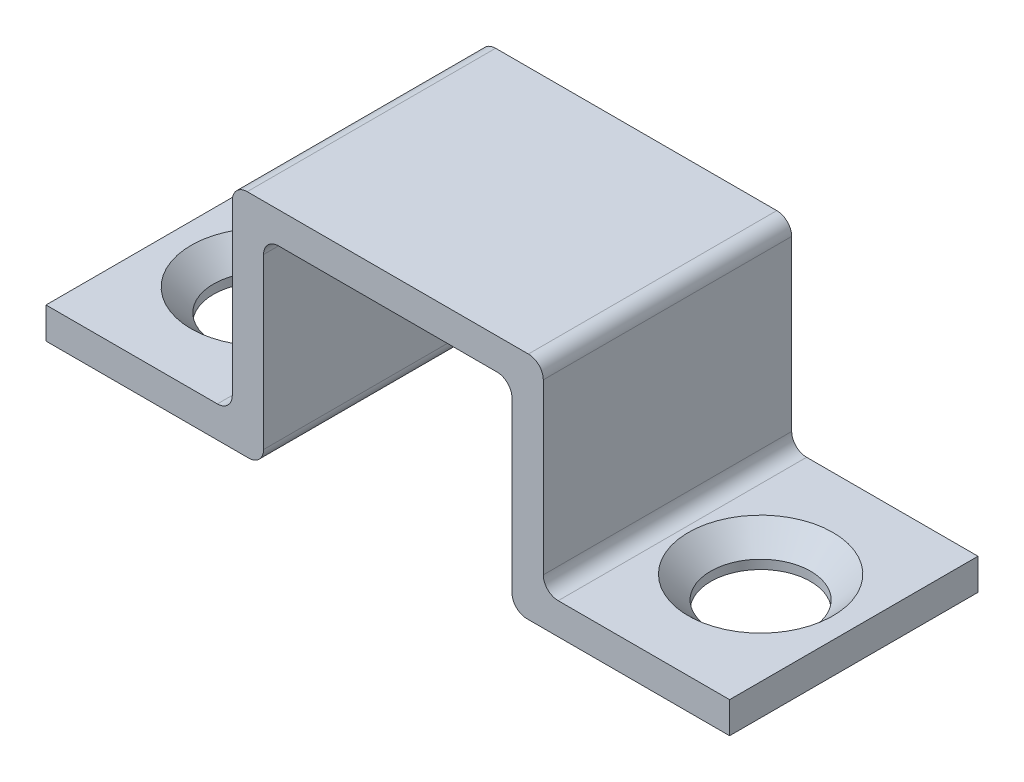
ISO-10303-21;
HEADER;
FILE_DESCRIPTION(('STEP AP214'),'2;1');
FILE_NAME('part.step','',(''),(''),'','','');
FILE_SCHEMA(('AUTOMOTIVE_DESIGN { 1 0 10303 214 1 1 1 1 }'));
ENDSEC;
DATA;
#1=APPLICATION_CONTEXT('core data for automotive mechanical design processes');
#2=APPLICATION_PROTOCOL_DEFINITION('international standard','automotive_design',2000,#1);
#3=PRODUCT_CONTEXT('',#1,'mechanical');
#4=PRODUCT('Part','Part','',(#3));
#5=PRODUCT_RELATED_PRODUCT_CATEGORY('part','',(#4));
#6=PRODUCT_DEFINITION_FORMATION('','',#4);
#7=PRODUCT_DEFINITION_CONTEXT('part definition',#1,'design');
#8=PRODUCT_DEFINITION('design','',#6,#7);
#9=PRODUCT_DEFINITION_SHAPE('','',#8);
#10=(LENGTH_UNIT() NAMED_UNIT(*) SI_UNIT(.MILLI.,.METRE.));
#11=(NAMED_UNIT(*) PLANE_ANGLE_UNIT() SI_UNIT($,.RADIAN.));
#12=(NAMED_UNIT(*) SI_UNIT($,.STERADIAN.) SOLID_ANGLE_UNIT());
#13=UNCERTAINTY_MEASURE_WITH_UNIT(LENGTH_MEASURE(1.E-05),#10,'distance_accuracy_value','');
#14=(GEOMETRIC_REPRESENTATION_CONTEXT(3) GLOBAL_UNCERTAINTY_ASSIGNED_CONTEXT((#13)) GLOBAL_UNIT_ASSIGNED_CONTEXT((#10,
#11,#12)) REPRESENTATION_CONTEXT('',''));
#15=CARTESIAN_POINT('',(0.,0.,0.));
#16=DIRECTION('',(0.,0.,1.));
#17=DIRECTION('',(1.,0.,0.));
#18=AXIS2_PLACEMENT_3D('',#15,#16,#17);
#19=CARTESIAN_POINT('',(-7.95019999999999,-10.16,6.35000000000001));
#20=DIRECTION('',(0.,-1.,0.));
#21=DIRECTION('',(0.,0.,-1.));
#22=AXIS2_PLACEMENT_3D('',#19,#20,#21);
#23=PLANE('',#22);
#24=DIRECTION('',(1.,0.,0.));
#25=VECTOR('',#24,1.);
#26=CARTESIAN_POINT('',(-7.95019999999999,-10.16,-6.35));
#27=LINE('',#26,#25);
#28=CARTESIAN_POINT('',(-17.4752,-10.16,-6.35));
#29=VERTEX_POINT('',#28);
#30=CARTESIAN_POINT('',(-7.11199999999999,-10.16,-6.35));
#31=VERTEX_POINT('',#30);
#32=EDGE_CURVE('E661',#29,#31,#27,.T.);
#33=ORIENTED_EDGE('',*,*,#32,.T.);
#34=DIRECTION('',(0.,0.,-1.));
#35=VECTOR('',#34,1.);
#36=CARTESIAN_POINT('',(-7.11199999999999,-10.16,6.35000000000001));
#37=LINE('',#36,#35);
#38=CARTESIAN_POINT('',(-7.11199999999999,-10.16,6.35000000000001));
#39=VERTEX_POINT('',#38);
#40=EDGE_CURVE('E482',#31,#39,#37,.F.);
#41=ORIENTED_EDGE('',*,*,#40,.T.);
#42=DIRECTION('',(1.,0.,0.));
#43=VECTOR('',#42,1.);
#44=CARTESIAN_POINT('',(-7.95019999999999,-10.16,6.35000000000001));
#45=LINE('',#44,#43);
#46=CARTESIAN_POINT('',(-17.4752,-10.16,6.35000000000001));
#47=VERTEX_POINT('',#46);
#48=EDGE_CURVE('E224',#47,#39,#45,.T.);
#49=ORIENTED_EDGE('',*,*,#48,.F.);
#50=DIRECTION('',(0.,0.,-1.));
#51=VECTOR('',#50,1.);
#52=CARTESIAN_POINT('',(-17.4752,-10.16,6.35000000000001));
#53=LINE('',#52,#51);
#54=EDGE_CURVE('E193',#47,#29,#53,.T.);
#55=ORIENTED_EDGE('',*,*,#54,.T.);
#56=EDGE_LOOP('',(#33,#41,#49,#55));
#57=FACE_BOUND('',#56,.T.);
#58=CARTESIAN_POINT('',(-12.7127,-10.16,0.));
#59=DIRECTION('',(0.,-1.,0.));
#60=DIRECTION('',(0.,0.,-1.));
#61=AXIS2_PLACEMENT_3D('',#58,#59,#60);
#62=CIRCLE('',#61,2.5527);
#63=CARTESIAN_POINT('',(-12.7127,-10.16,-2.5527));
#64=VERTEX_POINT('',#63);
#65=EDGE_CURVE('E194',#64,#64,#62,.F.);
#66=ORIENTED_EDGE('',*,*,#65,.T.);
#67=EDGE_LOOP('',(#66));
#68=FACE_BOUND('',#67,.T.);
#69=ADVANCED_FACE('F33',(#57,#68),#23,.T.);
#70=CARTESIAN_POINT('',(-17.4752,-8.5598,6.35000000000001));
#71=DIRECTION('',(0.,1.,0.));
#72=DIRECTION('',(0.,0.,1.));
#73=AXIS2_PLACEMENT_3D('',#70,#71,#72);
#74=PLANE('',#73);
#75=CARTESIAN_POINT('',(-12.7127,-8.5598,0.));
#76=DIRECTION('',(0.,1.,0.));
#77=DIRECTION('',(0.,0.,1.));
#78=AXIS2_PLACEMENT_3D('',#75,#76,#77);
#79=CIRCLE('',#78,3.69570000000001);
#80=CARTESIAN_POINT('',(-12.7127,-8.5598,3.69570000000002));
#81=VERTEX_POINT('',#80);
#82=EDGE_CURVE('E375',#81,#81,#79,.F.);
#83=ORIENTED_EDGE('',*,*,#82,.T.);
#84=EDGE_LOOP('',(#83));
#85=FACE_BOUND('',#84,.T.);
#86=DIRECTION('',(1.,0.,0.));
#87=VECTOR('',#86,1.);
#88=CARTESIAN_POINT('',(-17.4752,-8.5598,6.35000000000001));
#89=LINE('',#88,#87);
#90=CARTESIAN_POINT('',(-17.4752,-8.5598,6.35000000000001));
#91=VERTEX_POINT('',#90);
#92=CARTESIAN_POINT('',(-8.7122,-8.5598,6.35000000000001));
#93=VERTEX_POINT('',#92);
#94=EDGE_CURVE('E172',#91,#93,#89,.T.);
#95=ORIENTED_EDGE('',*,*,#94,.T.);
#96=DIRECTION('',(0.,0.,1.));
#97=VECTOR('',#96,1.);
#98=CARTESIAN_POINT('',(-8.71219999999999,-8.5598,-6.35));
#99=LINE('',#98,#97);
#100=CARTESIAN_POINT('',(-8.7122,-8.5598,-6.35));
#101=VERTEX_POINT('',#100);
#102=EDGE_CURVE('E354',#93,#101,#99,.F.);
#103=ORIENTED_EDGE('',*,*,#102,.T.);
#104=DIRECTION('',(1.,0.,0.));
#105=VECTOR('',#104,1.);
#106=CARTESIAN_POINT('',(-17.4752,-8.5598,-6.35));
#107=LINE('',#106,#105);
#108=CARTESIAN_POINT('',(-17.4752,-8.5598,-6.35));
#109=VERTEX_POINT('',#108);
#110=EDGE_CURVE('E184',#109,#101,#107,.T.);
#111=ORIENTED_EDGE('',*,*,#110,.F.);
#112=DIRECTION('',(0.,0.,1.));
#113=VECTOR('',#112,1.);
#114=CARTESIAN_POINT('',(-17.4752,-8.5598,6.35000000000001));
#115=LINE('',#114,#113);
#116=EDGE_CURVE('E190',#109,#91,#115,.T.);
#117=ORIENTED_EDGE('',*,*,#116,.T.);
#118=EDGE_LOOP('',(#95,#103,#111,#117));
#119=FACE_BOUND('',#118,.T.);
#120=ADVANCED_FACE('F196',(#85,#119),#74,.T.);
#121=CARTESIAN_POINT('',(-7.95019999999999,0.,0.));
#122=DIRECTION('',(-1.,0.,0.));
#123=DIRECTION('',(0.,0.,-1.));
#124=AXIS2_PLACEMENT_3D('',#121,#122,#123);
#125=PLANE('',#124);
#126=DIRECTION('',(0.,1.,0.));
#127=VECTOR('',#126,1.);
#128=CARTESIAN_POINT('',(-7.95019999999999,1.6002,-6.34999999999999));
#129=LINE('',#128,#127);
#130=CARTESIAN_POINT('',(-7.95019999999999,-7.7978,-6.35));
#131=VERTEX_POINT('',#130);
#132=CARTESIAN_POINT('',(-7.95019999999999,0.8382,-6.34999999999999));
#133=VERTEX_POINT('',#132);
#134=EDGE_CURVE('E212',#131,#133,#129,.T.);
#135=ORIENTED_EDGE('',*,*,#134,.F.);
#136=DIRECTION('',(0.,0.,1.));
#137=VECTOR('',#136,1.);
#138=CARTESIAN_POINT('',(-7.95019999999999,-7.7978,6.35000000000001));
#139=LINE('',#138,#137);
#140=CARTESIAN_POINT('',(-7.95019999999999,-7.7978,6.35000000000001));
#141=VERTEX_POINT('',#140);
#142=EDGE_CURVE('E490',#131,#141,#139,.T.);
#143=ORIENTED_EDGE('',*,*,#142,.T.);
#144=DIRECTION('',(0.,-1.,0.));
#145=VECTOR('',#144,1.);
#146=CARTESIAN_POINT('',(-7.95019999999999,1.6002,6.35000000000001));
#147=LINE('',#146,#145);
#148=CARTESIAN_POINT('',(-7.95019999999999,0.8382,6.35000000000001));
#149=VERTEX_POINT('',#148);
#150=EDGE_CURVE('E209',#149,#141,#147,.T.);
#151=ORIENTED_EDGE('',*,*,#150,.F.);
#152=DIRECTION('',(0.,0.,1.));
#153=VECTOR('',#152,1.);
#154=CARTESIAN_POINT('',(-7.95019999999999,0.8382,-6.34999999999999));
#155=LINE('',#154,#153);
#156=EDGE_CURVE('E488',#149,#133,#155,.F.);
#157=ORIENTED_EDGE('',*,*,#156,.T.);
#158=EDGE_LOOP('',(#135,#143,#151,#157));
#159=FACE_BOUND('',#158,.T.);
#160=ADVANCED_FACE('F403',(#159),#125,.T.);
#161=CARTESIAN_POINT('',(-6.35000000000001,1.6002,-6.34999999999999));
#162=DIRECTION('',(0.,0.,1.));
#163=DIRECTION('',(1.,0.,0.));
#164=AXIS2_PLACEMENT_3D('',#161,#162,#163);
#165=PLANE('',#164);
#166=DIRECTION('',(-1.,0.,0.));
#167=VECTOR('',#166,1.);
#168=CARTESIAN_POINT('',(7.95019999999999,-10.16,-6.35));
#169=LINE('',#168,#167);
#170=CARTESIAN_POINT('',(17.4752,-10.16,-6.35));
#171=VERTEX_POINT('',#170);
#172=CARTESIAN_POINT('',(7.11199999999999,-10.16,-6.35));
#173=VERTEX_POINT('',#172);
#174=EDGE_CURVE('E239',#171,#173,#169,.T.);
#175=ORIENTED_EDGE('',*,*,#174,.T.);
#176=CARTESIAN_POINT('',(7.11199999999999,-9.398,-6.34999999999999));
#177=DIRECTION('',(0.,0.,1.));
#178=DIRECTION('',(1.,0.,0.));
#179=AXIS2_PLACEMENT_3D('',#176,#177,#178);
#180=CIRCLE('',#179,0.762);
#181=CARTESIAN_POINT('',(6.34999999999999,-9.398,-6.35));
#182=VERTEX_POINT('',#181);
#183=EDGE_CURVE('E255',#173,#182,#180,.F.);
#184=ORIENTED_EDGE('',*,*,#183,.T.);
#185=DIRECTION('',(0.,1.,0.));
#186=VECTOR('',#185,1.);
#187=CARTESIAN_POINT('',(6.34999999999999,1.6002,-6.34999999999999));
#188=LINE('',#187,#186);
#189=CARTESIAN_POINT('',(6.34999999999999,-0.761999999999999,-6.34999999999999));
#190=VERTEX_POINT('',#189);
#191=EDGE_CURVE('E240',#182,#190,#188,.T.);
#192=ORIENTED_EDGE('',*,*,#191,.T.);
#193=CARTESIAN_POINT('',(5.58799999999999,-0.762,-6.34999999999999));
#194=DIRECTION('',(0.,0.,1.));
#195=DIRECTION('',(1.,0.,0.));
#196=AXIS2_PLACEMENT_3D('',#193,#194,#195);
#197=CIRCLE('',#196,0.762);
#198=CARTESIAN_POINT('',(5.58799999999999,0.,-6.34999999999999));
#199=VERTEX_POINT('',#198);
#200=EDGE_CURVE('E361',#190,#199,#197,.T.);
#201=ORIENTED_EDGE('',*,*,#200,.T.);
#202=DIRECTION('',(-1.,0.,0.));
#203=VECTOR('',#202,1.);
#204=CARTESIAN_POINT('',(-6.35000000000001,0.,-6.34999999999999));
#205=LINE('',#204,#203);
#206=CARTESIAN_POINT('',(-5.58799999999999,0.,-6.34999999999999));
#207=VERTEX_POINT('',#206);
#208=EDGE_CURVE('E230',#199,#207,#205,.T.);
#209=ORIENTED_EDGE('',*,*,#208,.T.);
#210=CARTESIAN_POINT('',(-5.58799999999999,-0.762,-6.34999999999999));
#211=DIRECTION('',(0.,0.,1.));
#212=DIRECTION('',(1.,0.,0.));
#213=AXIS2_PLACEMENT_3D('',#210,#211,#212);
#214=CIRCLE('',#213,0.762);
#215=CARTESIAN_POINT('',(-6.34999999999999,-0.761999999999999,-6.34999999999999));
#216=VERTEX_POINT('',#215);
#217=EDGE_CURVE('E366',#207,#216,#214,.T.);
#218=ORIENTED_EDGE('',*,*,#217,.T.);
#219=DIRECTION('',(0.,1.,0.));
#220=VECTOR('',#219,1.);
#221=CARTESIAN_POINT('',(-6.34999999999999,1.6002,-6.34999999999999));
#222=LINE('',#221,#220);
#223=CARTESIAN_POINT('',(-6.34999999999999,-9.398,-6.35));
#224=VERTEX_POINT('',#223);
#225=EDGE_CURVE('E213',#224,#216,#222,.T.);
#226=ORIENTED_EDGE('',*,*,#225,.F.);
#227=CARTESIAN_POINT('',(-7.11199999999999,-9.398,-6.34999999999999));
#228=DIRECTION('',(0.,0.,1.));
#229=DIRECTION('',(1.,0.,0.));
#230=AXIS2_PLACEMENT_3D('',#227,#228,#229);
#231=CIRCLE('',#230,0.762);
#232=EDGE_CURVE('E334',#224,#31,#231,.F.);
#233=ORIENTED_EDGE('',*,*,#232,.T.);
#234=ORIENTED_EDGE('',*,*,#32,.F.);
#235=DIRECTION('',(0.,1.,0.));
#236=VECTOR('',#235,1.);
#237=CARTESIAN_POINT('',(-17.4752,-10.16,-6.35));
#238=LINE('',#237,#236);
#239=EDGE_CURVE('E198',#29,#109,#238,.T.);
#240=ORIENTED_EDGE('',*,*,#239,.T.);
#241=ORIENTED_EDGE('',*,*,#110,.T.);
#242=CARTESIAN_POINT('',(-8.71219999999999,-7.7978,-6.34999999999999));
#243=DIRECTION('',(0.,0.,1.));
#244=DIRECTION('',(1.,0.,0.));
#245=AXIS2_PLACEMENT_3D('',#242,#243,#244);
#246=CIRCLE('',#245,0.762);
#247=EDGE_CURVE('E369',#101,#131,#246,.T.);
#248=ORIENTED_EDGE('',*,*,#247,.T.);
#249=ORIENTED_EDGE('',*,*,#134,.T.);
#250=CARTESIAN_POINT('',(-7.18819999999999,0.8382,-6.34999999999999));
#251=DIRECTION('',(0.,0.,1.));
#252=DIRECTION('',(1.,0.,0.));
#253=AXIS2_PLACEMENT_3D('',#250,#251,#252);
#254=CIRCLE('',#253,0.762);
#255=CARTESIAN_POINT('',(-7.18819999999999,1.6002,-6.34999999999999));
#256=VERTEX_POINT('',#255);
#257=EDGE_CURVE('E291',#133,#256,#254,.F.);
#258=ORIENTED_EDGE('',*,*,#257,.T.);
#259=DIRECTION('',(-1.,0.,0.));
#260=VECTOR('',#259,1.);
#261=CARTESIAN_POINT('',(-6.35000000000001,1.6002,-6.34999999999999));
#262=LINE('',#261,#260);
#263=CARTESIAN_POINT('',(7.18819999999999,1.6002,-6.34999999999999));
#264=VERTEX_POINT('',#263);
#265=EDGE_CURVE('E264',#264,#256,#262,.T.);
#266=ORIENTED_EDGE('',*,*,#265,.F.);
#267=CARTESIAN_POINT('',(7.18819999999999,0.8382,-6.34999999999999));
#268=DIRECTION('',(0.,0.,1.));
#269=DIRECTION('',(1.,0.,0.));
#270=AXIS2_PLACEMENT_3D('',#267,#268,#269);
#271=CIRCLE('',#270,0.762);
#272=CARTESIAN_POINT('',(7.95019999999999,0.8382,-6.34999999999999));
#273=VERTEX_POINT('',#272);
#274=EDGE_CURVE('E285',#264,#273,#271,.F.);
#275=ORIENTED_EDGE('',*,*,#274,.T.);
#276=DIRECTION('',(0.,1.,0.));
#277=VECTOR('',#276,1.);
#278=CARTESIAN_POINT('',(7.95019999999999,1.6002,-6.34999999999999));
#279=LINE('',#278,#277);
#280=CARTESIAN_POINT('',(7.95019999999999,-7.7978,-6.35));
#281=VERTEX_POINT('',#280);
#282=EDGE_CURVE('E235',#281,#273,#279,.T.);
#283=ORIENTED_EDGE('',*,*,#282,.F.);
#284=CARTESIAN_POINT('',(8.71219999999999,-7.7978,-6.34999999999999));
#285=DIRECTION('',(0.,0.,1.));
#286=DIRECTION('',(1.,0.,0.));
#287=AXIS2_PLACEMENT_3D('',#284,#285,#286);
#288=CIRCLE('',#287,0.762);
#289=CARTESIAN_POINT('',(8.7122,-8.5598,-6.35));
#290=VERTEX_POINT('',#289);
#291=EDGE_CURVE('E373',#281,#290,#288,.T.);
#292=ORIENTED_EDGE('',*,*,#291,.T.);
#293=DIRECTION('',(-1.,0.,0.));
#294=VECTOR('',#293,1.);
#295=CARTESIAN_POINT('',(17.4752,-8.5598,-6.35));
#296=LINE('',#295,#294);
#297=CARTESIAN_POINT('',(17.4752,-8.5598,-6.35));
#298=VERTEX_POINT('',#297);
#299=EDGE_CURVE('E254',#298,#290,#296,.T.);
#300=ORIENTED_EDGE('',*,*,#299,.F.);
#301=DIRECTION('',(0.,1.,0.));
#302=VECTOR('',#301,1.);
#303=CARTESIAN_POINT('',(17.4752,-10.16,-6.35));
#304=LINE('',#303,#302);
#305=EDGE_CURVE('E307',#171,#298,#304,.T.);
#306=ORIENTED_EDGE('',*,*,#305,.F.);
#307=EDGE_LOOP('',(#175,#184,#192,#201,#209,#218,#226,#233,#234,#240,#241,#248,#249,#258,#266,
#275,#283,#292,#300,#306));
#308=FACE_BOUND('',#307,.T.);
#309=ADVANCED_FACE('F303',(#308),#165,.F.);
#310=CARTESIAN_POINT('',(-6.35000000000001,1.6002,6.35000000000001));
#311=DIRECTION('',(0.,0.,-1.));
#312=DIRECTION('',(-1.,0.,0.));
#313=AXIS2_PLACEMENT_3D('',#310,#311,#312);
#314=PLANE('',#313);
#315=DIRECTION('',(0.,-1.,0.));
#316=VECTOR('',#315,1.);
#317=CARTESIAN_POINT('',(6.34999999999999,1.6002,6.35000000000001));
#318=LINE('',#317,#316);
#319=CARTESIAN_POINT('',(6.34999999999999,-0.761999999999999,6.35000000000001));
#320=VERTEX_POINT('',#319);
#321=CARTESIAN_POINT('',(6.34999999999999,-9.398,6.35000000000001));
#322=VERTEX_POINT('',#321);
#323=EDGE_CURVE('E251',#320,#322,#318,.T.);
#324=ORIENTED_EDGE('',*,*,#323,.T.);
#325=CARTESIAN_POINT('',(7.11199999999999,-9.398,6.35000000000001));
#326=DIRECTION('',(0.,0.,-1.));
#327=DIRECTION('',(-1.,0.,0.));
#328=AXIS2_PLACEMENT_3D('',#325,#326,#327);
#329=CIRCLE('',#328,0.762);
#330=CARTESIAN_POINT('',(7.11199999999999,-10.16,6.35000000000001));
#331=VERTEX_POINT('',#330);
#332=EDGE_CURVE('E330',#322,#331,#329,.F.);
#333=ORIENTED_EDGE('',*,*,#332,.T.);
#334=DIRECTION('',(-1.,0.,0.));
#335=VECTOR('',#334,1.);
#336=CARTESIAN_POINT('',(7.95019999999999,-10.16,6.35000000000001));
#337=LINE('',#336,#335);
#338=CARTESIAN_POINT('',(17.4752,-10.16,6.35000000000001));
#339=VERTEX_POINT('',#338);
#340=EDGE_CURVE('E300',#339,#331,#337,.T.);
#341=ORIENTED_EDGE('',*,*,#340,.F.);
#342=DIRECTION('',(0.,-1.,0.));
#343=VECTOR('',#342,1.);
#344=CARTESIAN_POINT('',(17.4752,-10.16,6.35000000000001));
#345=LINE('',#344,#343);
#346=CARTESIAN_POINT('',(17.4752,-8.5598,6.35000000000001));
#347=VERTEX_POINT('',#346);
#348=EDGE_CURVE('E316',#347,#339,#345,.T.);
#349=ORIENTED_EDGE('',*,*,#348,.F.);
#350=DIRECTION('',(-1.,0.,0.));
#351=VECTOR('',#350,1.);
#352=CARTESIAN_POINT('',(17.4752,-8.5598,6.35000000000001));
#353=LINE('',#352,#351);
#354=CARTESIAN_POINT('',(8.7122,-8.5598,6.35000000000001));
#355=VERTEX_POINT('',#354);
#356=EDGE_CURVE('E269',#347,#355,#353,.T.);
#357=ORIENTED_EDGE('',*,*,#356,.T.);
#358=CARTESIAN_POINT('',(8.71219999999999,-7.7978,6.35000000000001));
#359=DIRECTION('',(0.,0.,-1.));
#360=DIRECTION('',(-1.,0.,0.));
#361=AXIS2_PLACEMENT_3D('',#358,#359,#360);
#362=CIRCLE('',#361,0.762);
#363=CARTESIAN_POINT('',(7.95019999999999,-7.7978,6.35000000000001));
#364=VERTEX_POINT('',#363);
#365=EDGE_CURVE('E371',#355,#364,#362,.T.);
#366=ORIENTED_EDGE('',*,*,#365,.T.);
#367=DIRECTION('',(0.,-1.,0.));
#368=VECTOR('',#367,1.);
#369=CARTESIAN_POINT('',(7.95019999999999,1.6002,6.35000000000001));
#370=LINE('',#369,#368);
#371=CARTESIAN_POINT('',(7.95019999999999,0.8382,6.35000000000001));
#372=VERTEX_POINT('',#371);
#373=EDGE_CURVE('E214',#372,#364,#370,.T.);
#374=ORIENTED_EDGE('',*,*,#373,.F.);
#375=CARTESIAN_POINT('',(7.18819999999999,0.8382,6.35000000000001));
#376=DIRECTION('',(0.,0.,-1.));
#377=DIRECTION('',(-1.,0.,0.));
#378=AXIS2_PLACEMENT_3D('',#375,#376,#377);
#379=CIRCLE('',#378,0.762);
#380=CARTESIAN_POINT('',(7.18819999999999,1.6002,6.35000000000001));
#381=VERTEX_POINT('',#380);
#382=EDGE_CURVE('E218',#372,#381,#379,.F.);
#383=ORIENTED_EDGE('',*,*,#382,.T.);
#384=DIRECTION('',(1.,0.,0.));
#385=VECTOR('',#384,1.);
#386=CARTESIAN_POINT('',(-6.35000000000001,1.6002,6.35000000000001));
#387=LINE('',#386,#385);
#388=CARTESIAN_POINT('',(-7.18819999999999,1.6002,6.35000000000001));
#389=VERTEX_POINT('',#388);
#390=EDGE_CURVE('E286',#389,#381,#387,.T.);
#391=ORIENTED_EDGE('',*,*,#390,.F.);
#392=CARTESIAN_POINT('',(-7.18819999999999,0.8382,6.35000000000001));
#393=DIRECTION('',(0.,0.,-1.));
#394=DIRECTION('',(-1.,0.,0.));
#395=AXIS2_PLACEMENT_3D('',#392,#393,#394);
#396=CIRCLE('',#395,0.762);
#397=EDGE_CURVE('E349',#389,#149,#396,.F.);
#398=ORIENTED_EDGE('',*,*,#397,.T.);
#399=ORIENTED_EDGE('',*,*,#150,.T.);
#400=CARTESIAN_POINT('',(-8.71219999999999,-7.7978,6.35000000000001));
#401=DIRECTION('',(0.,0.,-1.));
#402=DIRECTION('',(-1.,0.,0.));
#403=AXIS2_PLACEMENT_3D('',#400,#401,#402);
#404=CIRCLE('',#403,0.762);
#405=EDGE_CURVE('E179',#141,#93,#404,.T.);
#406=ORIENTED_EDGE('',*,*,#405,.T.);
#407=ORIENTED_EDGE('',*,*,#94,.F.);
#408=DIRECTION('',(0.,-1.,0.));
#409=VECTOR('',#408,1.);
#410=CARTESIAN_POINT('',(-17.4752,-10.16,6.35000000000001));
#411=LINE('',#410,#409);
#412=EDGE_CURVE('E176',#91,#47,#411,.T.);
#413=ORIENTED_EDGE('',*,*,#412,.T.);
#414=ORIENTED_EDGE('',*,*,#48,.T.);
#415=CARTESIAN_POINT('',(-7.11199999999999,-9.398,6.35000000000001));
#416=DIRECTION('',(0.,0.,-1.));
#417=DIRECTION('',(-1.,0.,0.));
#418=AXIS2_PLACEMENT_3D('',#415,#416,#417);
#419=CIRCLE('',#418,0.762);
#420=CARTESIAN_POINT('',(-6.34999999999999,-9.398,6.35000000000001));
#421=VERTEX_POINT('',#420);
#422=EDGE_CURVE('E48',#39,#421,#419,.F.);
#423=ORIENTED_EDGE('',*,*,#422,.T.);
#424=DIRECTION('',(0.,-1.,0.));
#425=VECTOR('',#424,1.);
#426=CARTESIAN_POINT('',(-6.34999999999999,1.6002,6.35000000000001));
#427=LINE('',#426,#425);
#428=CARTESIAN_POINT('',(-6.34999999999999,-0.761999999999999,6.35000000000001));
#429=VERTEX_POINT('',#428);
#430=EDGE_CURVE('E183',#429,#421,#427,.T.);
#431=ORIENTED_EDGE('',*,*,#430,.F.);
#432=CARTESIAN_POINT('',(-5.58799999999999,-0.762,6.35000000000001));
#433=DIRECTION('',(0.,0.,-1.));
#434=DIRECTION('',(-1.,0.,0.));
#435=AXIS2_PLACEMENT_3D('',#432,#433,#434);
#436=CIRCLE('',#435,0.762);
#437=CARTESIAN_POINT('',(-5.58799999999999,0.,6.35000000000001));
#438=VERTEX_POINT('',#437);
#439=EDGE_CURVE('E56',#429,#438,#436,.T.);
#440=ORIENTED_EDGE('',*,*,#439,.T.);
#441=DIRECTION('',(1.,0.,0.));
#442=VECTOR('',#441,1.);
#443=CARTESIAN_POINT('',(-6.35000000000001,0.,6.35000000000001));
#444=LINE('',#443,#442);
#445=CARTESIAN_POINT('',(5.58799999999999,0.,6.35000000000001));
#446=VERTEX_POINT('',#445);
#447=EDGE_CURVE('E261',#438,#446,#444,.T.);
#448=ORIENTED_EDGE('',*,*,#447,.T.);
#449=CARTESIAN_POINT('',(5.58799999999999,-0.762,6.35000000000001));
#450=DIRECTION('',(0.,0.,-1.));
#451=DIRECTION('',(-1.,0.,0.));
#452=AXIS2_PLACEMENT_3D('',#449,#450,#451);
#453=CIRCLE('',#452,0.762);
#454=EDGE_CURVE('E363',#446,#320,#453,.T.);
#455=ORIENTED_EDGE('',*,*,#454,.T.);
#456=EDGE_LOOP('',(#324,#333,#341,#349,#357,#366,#374,#383,#391,#398,#399,#406,#407,#413,#414,
#423,#431,#440,#448,#455));
#457=FACE_BOUND('',#456,.T.);
#458=ADVANCED_FACE('F175',(#457),#314,.F.);
#459=CARTESIAN_POINT('',(0.,1.6002,0.));
#460=DIRECTION('',(0.,-1.,0.));
#461=DIRECTION('',(0.,0.,-1.));
#462=AXIS2_PLACEMENT_3D('',#459,#460,#461);
#463=PLANE('',#462);
#464=ORIENTED_EDGE('',*,*,#265,.T.);
#465=DIRECTION('',(0.,0.,1.));
#466=VECTOR('',#465,1.);
#467=CARTESIAN_POINT('',(-7.18819999999999,1.6002,6.35000000000001));
#468=LINE('',#467,#466);
#469=EDGE_CURVE('E346',#256,#389,#468,.T.);
#470=ORIENTED_EDGE('',*,*,#469,.T.);
#471=ORIENTED_EDGE('',*,*,#390,.T.);
#472=DIRECTION('',(0.,0.,1.));
#473=VECTOR('',#472,1.);
#474=CARTESIAN_POINT('',(7.18819999999999,1.6002,-6.34999999999999));
#475=LINE('',#474,#473);
#476=EDGE_CURVE('E347',#381,#264,#475,.F.);
#477=ORIENTED_EDGE('',*,*,#476,.T.);
#478=EDGE_LOOP('',(#464,#470,#471,#477));
#479=FACE_BOUND('',#478,.T.);
#480=ADVANCED_FACE('F345',(#479),#463,.F.);
#481=CARTESIAN_POINT('',(0.,0.,0.));
#482=DIRECTION('',(0.,-1.,0.));
#483=DIRECTION('',(0.,0.,-1.));
#484=AXIS2_PLACEMENT_3D('',#481,#482,#483);
#485=PLANE('',#484);
#486=ORIENTED_EDGE('',*,*,#208,.F.);
#487=DIRECTION('',(0.,0.,-1.));
#488=VECTOR('',#487,1.);
#489=CARTESIAN_POINT('',(5.58799999999999,0.,0.));
#490=LINE('',#489,#488);
#491=EDGE_CURVE('E486',#199,#446,#490,.F.);
#492=ORIENTED_EDGE('',*,*,#491,.T.);
#493=ORIENTED_EDGE('',*,*,#447,.F.);
#494=DIRECTION('',(0.,0.,1.));
#495=VECTOR('',#494,1.);
#496=CARTESIAN_POINT('',(-5.58799999999999,0.,0.));
#497=LINE('',#496,#495);
#498=EDGE_CURVE('E484',#438,#207,#497,.F.);
#499=ORIENTED_EDGE('',*,*,#498,.T.);
#500=EDGE_LOOP('',(#486,#492,#493,#499));
#501=FACE_BOUND('',#500,.T.);
#502=ADVANCED_FACE('F425',(#501),#485,.T.);
#503=CARTESIAN_POINT('',(6.34999999999999,0.,0.));
#504=DIRECTION('',(1.,0.,0.));
#505=DIRECTION('',(0.,0.,-1.));
#506=AXIS2_PLACEMENT_3D('',#503,#504,#505);
#507=PLANE('',#506);
#508=ORIENTED_EDGE('',*,*,#191,.F.);
#509=DIRECTION('',(0.,0.,-1.));
#510=VECTOR('',#509,1.);
#511=CARTESIAN_POINT('',(6.34999999999999,-9.398,0.));
#512=LINE('',#511,#510);
#513=EDGE_CURVE('E260',#182,#322,#512,.F.);
#514=ORIENTED_EDGE('',*,*,#513,.T.);
#515=ORIENTED_EDGE('',*,*,#323,.F.);
#516=DIRECTION('',(0.,0.,-1.));
#517=VECTOR('',#516,1.);
#518=CARTESIAN_POINT('',(6.34999999999999,-0.762,0.));
#519=LINE('',#518,#517);
#520=EDGE_CURVE('E257',#320,#190,#519,.T.);
#521=ORIENTED_EDGE('',*,*,#520,.T.);
#522=EDGE_LOOP('',(#508,#514,#515,#521));
#523=FACE_BOUND('',#522,.T.);
#524=ADVANCED_FACE('F422',(#523),#507,.F.);
#525=CARTESIAN_POINT('',(7.95019999999999,-10.16,6.35000000000001));
#526=DIRECTION('',(0.,1.,0.));
#527=DIRECTION('',(0.,0.,1.));
#528=AXIS2_PLACEMENT_3D('',#525,#526,#527);
#529=PLANE('',#528);
#530=CARTESIAN_POINT('',(12.7127,-10.16,0.));
#531=DIRECTION('',(0.,1.,0.));
#532=DIRECTION('',(0.,0.,1.));
#533=AXIS2_PLACEMENT_3D('',#530,#531,#532);
#534=CIRCLE('',#533,2.5527);
#535=CARTESIAN_POINT('',(12.7127,-10.16,2.5527));
#536=VERTEX_POINT('',#535);
#537=EDGE_CURVE('E319',#536,#536,#534,.T.);
#538=ORIENTED_EDGE('',*,*,#537,.T.);
#539=EDGE_LOOP('',(#538));
#540=FACE_BOUND('',#539,.T.);
#541=ORIENTED_EDGE('',*,*,#340,.T.);
#542=DIRECTION('',(0.,0.,-1.));
#543=VECTOR('',#542,1.);
#544=CARTESIAN_POINT('',(7.11199999999999,-10.16,6.35000000000001));
#545=LINE('',#544,#543);
#546=EDGE_CURVE('E283',#331,#173,#545,.T.);
#547=ORIENTED_EDGE('',*,*,#546,.T.);
#548=ORIENTED_EDGE('',*,*,#174,.F.);
#549=DIRECTION('',(0.,0.,-1.));
#550=VECTOR('',#549,1.);
#551=CARTESIAN_POINT('',(17.4752,-10.16,6.35000000000001));
#552=LINE('',#551,#550);
#553=EDGE_CURVE('E311',#339,#171,#552,.T.);
#554=ORIENTED_EDGE('',*,*,#553,.F.);
#555=EDGE_LOOP('',(#541,#547,#548,#554));
#556=FACE_BOUND('',#555,.T.);
#557=ADVANCED_FACE('F310',(#540,#556),#529,.F.);
#558=CARTESIAN_POINT('',(7.95019999999999,0.,0.));
#559=DIRECTION('',(1.,0.,0.));
#560=DIRECTION('',(0.,0.,-1.));
#561=AXIS2_PLACEMENT_3D('',#558,#559,#560);
#562=PLANE('',#561);
#563=ORIENTED_EDGE('',*,*,#282,.T.);
#564=DIRECTION('',(0.,0.,1.));
#565=VECTOR('',#564,1.);
#566=CARTESIAN_POINT('',(7.95019999999999,0.8382,6.35000000000001));
#567=LINE('',#566,#565);
#568=EDGE_CURVE('E352',#273,#372,#567,.T.);
#569=ORIENTED_EDGE('',*,*,#568,.T.);
#570=ORIENTED_EDGE('',*,*,#373,.T.);
#571=DIRECTION('',(0.,0.,1.));
#572=VECTOR('',#571,1.);
#573=CARTESIAN_POINT('',(7.95019999999999,-7.7978,0.));
#574=LINE('',#573,#572);
#575=EDGE_CURVE('E350',#364,#281,#574,.F.);
#576=ORIENTED_EDGE('',*,*,#575,.T.);
#577=EDGE_LOOP('',(#563,#569,#570,#576));
#578=FACE_BOUND('',#577,.T.);
#579=ADVANCED_FACE('F417',(#578),#562,.T.);
#580=CARTESIAN_POINT('',(17.4752,-8.5598,6.35000000000001));
#581=DIRECTION('',(0.,-1.,0.));
#582=DIRECTION('',(0.,0.,-1.));
#583=AXIS2_PLACEMENT_3D('',#580,#581,#582);
#584=PLANE('',#583);
#585=CARTESIAN_POINT('',(12.7127,-8.5598,0.));
#586=DIRECTION('',(0.,-1.,0.));
#587=DIRECTION('',(0.,0.,-1.));
#588=AXIS2_PLACEMENT_3D('',#585,#586,#587);
#589=CIRCLE('',#588,3.69570000000001);
#590=CARTESIAN_POINT('',(12.7127,-8.5598,-3.6957));
#591=VERTEX_POINT('',#590);
#592=EDGE_CURVE('E11',#591,#591,#589,.T.);
#593=ORIENTED_EDGE('',*,*,#592,.T.);
#594=EDGE_LOOP('',(#593));
#595=FACE_BOUND('',#594,.T.);
#596=ORIENTED_EDGE('',*,*,#299,.T.);
#597=DIRECTION('',(0.,0.,1.));
#598=VECTOR('',#597,1.);
#599=CARTESIAN_POINT('',(8.71219999999999,-8.5598,6.35000000000001));
#600=LINE('',#599,#598);
#601=EDGE_CURVE('E328',#290,#355,#600,.T.);
#602=ORIENTED_EDGE('',*,*,#601,.T.);
#603=ORIENTED_EDGE('',*,*,#356,.F.);
#604=DIRECTION('',(0.,0.,1.));
#605=VECTOR('',#604,1.);
#606=CARTESIAN_POINT('',(17.4752,-8.5598,6.35000000000001));
#607=LINE('',#606,#605);
#608=EDGE_CURVE('E272',#298,#347,#607,.T.);
#609=ORIENTED_EDGE('',*,*,#608,.F.);
#610=EDGE_LOOP('',(#596,#602,#603,#609));
#611=FACE_BOUND('',#610,.T.);
#612=ADVANCED_FACE('F326',(#595,#611),#584,.F.);
#613=CARTESIAN_POINT('',(17.4752,0.,0.));
#614=DIRECTION('',(-1.,0.,0.));
#615=DIRECTION('',(0.,0.,1.));
#616=AXIS2_PLACEMENT_3D('',#613,#614,#615);
#617=PLANE('',#616);
#618=ORIENTED_EDGE('',*,*,#348,.T.);
#619=ORIENTED_EDGE('',*,*,#553,.T.);
#620=ORIENTED_EDGE('',*,*,#305,.T.);
#621=ORIENTED_EDGE('',*,*,#608,.T.);
#622=EDGE_LOOP('',(#618,#619,#620,#621));
#623=FACE_BOUND('',#622,.T.);
#624=ADVANCED_FACE('F314',(#623),#617,.F.);
#625=CARTESIAN_POINT('',(12.7127,-10.160025,0.));
#626=DIRECTION('',(0.,1.,0.));
#627=DIRECTION('',(0.,0.,1.));
#628=AXIS2_PLACEMENT_3D('',#625,#626,#627);
#629=CYLINDRICAL_SURFACE('',#628,2.5527);
#630=CARTESIAN_POINT('',(12.7127,-9.70280000000001,0.));
#631=DIRECTION('',(0.,-1.,0.));
#632=DIRECTION('',(0.,0.,-1.));
#633=AXIS2_PLACEMENT_3D('',#630,#631,#632);
#634=CIRCLE('',#633,2.5527);
#635=CARTESIAN_POINT('',(12.7127,-9.70280000000001,-2.5527));
#636=VERTEX_POINT('',#635);
#637=EDGE_CURVE('E41',#636,#636,#634,.F.);
#638=ORIENTED_EDGE('',*,*,#637,.T.);
#639=EDGE_LOOP('',(#638));
#640=FACE_BOUND('',#639,.T.);
#641=ORIENTED_EDGE('',*,*,#537,.F.);
#642=EDGE_LOOP('',(#641));
#643=FACE_BOUND('',#642,.T.);
#644=ADVANCED_FACE('F383',(#640,#643),#629,.F.);
#645=CARTESIAN_POINT('',(-6.34999999999999,0.,0.));
#646=DIRECTION('',(-1.,0.,0.));
#647=DIRECTION('',(0.,0.,-1.));
#648=AXIS2_PLACEMENT_3D('',#645,#646,#647);
#649=PLANE('',#648);
#650=ORIENTED_EDGE('',*,*,#430,.T.);
#651=DIRECTION('',(0.,0.,-1.));
#652=VECTOR('',#651,1.);
#653=CARTESIAN_POINT('',(-6.34999999999999,-9.398,-6.35));
#654=LINE('',#653,#652);
#655=EDGE_CURVE('E479',#421,#224,#654,.T.);
#656=ORIENTED_EDGE('',*,*,#655,.T.);
#657=ORIENTED_EDGE('',*,*,#225,.T.);
#658=DIRECTION('',(0.,0.,1.));
#659=VECTOR('',#658,1.);
#660=CARTESIAN_POINT('',(-6.34999999999999,-0.762,0.));
#661=LINE('',#660,#659);
#662=EDGE_CURVE('E477',#216,#429,#661,.T.);
#663=ORIENTED_EDGE('',*,*,#662,.T.);
#664=EDGE_LOOP('',(#650,#656,#657,#663));
#665=FACE_BOUND('',#664,.T.);
#666=ADVANCED_FACE('F409',(#665),#649,.F.);
#667=CARTESIAN_POINT('',(-17.4752,0.,0.));
#668=DIRECTION('',(1.,0.,0.));
#669=DIRECTION('',(0.,0.,1.));
#670=AXIS2_PLACEMENT_3D('',#667,#668,#669);
#671=PLANE('',#670);
#672=ORIENTED_EDGE('',*,*,#412,.F.);
#673=ORIENTED_EDGE('',*,*,#116,.F.);
#674=ORIENTED_EDGE('',*,*,#239,.F.);
#675=ORIENTED_EDGE('',*,*,#54,.F.);
#676=EDGE_LOOP('',(#672,#673,#674,#675));
#677=FACE_BOUND('',#676,.T.);
#678=ADVANCED_FACE('F188',(#677),#671,.F.);
#679=CARTESIAN_POINT('',(-12.7127,-10.160025,0.));
#680=DIRECTION('',(0.,1.,0.));
#681=DIRECTION('',(0.,0.,1.));
#682=AXIS2_PLACEMENT_3D('',#679,#680,#681);
#683=CYLINDRICAL_SURFACE('',#682,2.5527);
#684=CARTESIAN_POINT('',(-12.7127,-9.70280000000002,0.));
#685=DIRECTION('',(0.,1.,0.));
#686=DIRECTION('',(0.,0.,1.));
#687=AXIS2_PLACEMENT_3D('',#684,#685,#686);
#688=CIRCLE('',#687,2.5527);
#689=CARTESIAN_POINT('',(-12.7127,-9.70280000000002,2.5527));
#690=VERTEX_POINT('',#689);
#691=EDGE_CURVE('E378',#690,#690,#688,.T.);
#692=ORIENTED_EDGE('',*,*,#691,.T.);
#693=EDGE_LOOP('',(#692));
#694=FACE_BOUND('',#693,.T.);
#695=ORIENTED_EDGE('',*,*,#65,.F.);
#696=EDGE_LOOP('',(#695));
#697=FACE_BOUND('',#696,.T.);
#698=ADVANCED_FACE('F442',(#694,#697),#683,.F.);
#699=CARTESIAN_POINT('',(7.11199999999999,-9.398,6.35000000000001));
#700=DIRECTION('',(0.,0.,-1.));
#701=DIRECTION('',(-1.,0.,0.));
#702=AXIS2_PLACEMENT_3D('',#699,#700,#701);
#703=CYLINDRICAL_SURFACE('',#702,0.762);
#704=ORIENTED_EDGE('',*,*,#332,.F.);
#705=ORIENTED_EDGE('',*,*,#513,.F.);
#706=ORIENTED_EDGE('',*,*,#183,.F.);
#707=ORIENTED_EDGE('',*,*,#546,.F.);
#708=EDGE_LOOP('',(#704,#705,#706,#707));
#709=FACE_BOUND('',#708,.T.);
#710=ADVANCED_FACE('F332',(#709),#703,.T.);
#711=CARTESIAN_POINT('',(-7.11199999999999,-9.398,0.));
#712=DIRECTION('',(0.,0.,1.));
#713=DIRECTION('',(1.,0.,0.));
#714=AXIS2_PLACEMENT_3D('',#711,#712,#713);
#715=CYLINDRICAL_SURFACE('',#714,0.762);
#716=ORIENTED_EDGE('',*,*,#422,.F.);
#717=ORIENTED_EDGE('',*,*,#40,.F.);
#718=ORIENTED_EDGE('',*,*,#232,.F.);
#719=ORIENTED_EDGE('',*,*,#655,.F.);
#720=EDGE_LOOP('',(#716,#717,#718,#719));
#721=FACE_BOUND('',#720,.T.);
#722=ADVANCED_FACE('F441',(#721),#715,.T.);
#723=CARTESIAN_POINT('',(5.58799999999999,-0.762,0.));
#724=DIRECTION('',(0.,0.,-1.));
#725=DIRECTION('',(-1.,0.,0.));
#726=AXIS2_PLACEMENT_3D('',#723,#724,#725);
#727=CYLINDRICAL_SURFACE('',#726,0.762);
#728=ORIENTED_EDGE('',*,*,#454,.F.);
#729=ORIENTED_EDGE('',*,*,#491,.F.);
#730=ORIENTED_EDGE('',*,*,#200,.F.);
#731=ORIENTED_EDGE('',*,*,#520,.F.);
#732=EDGE_LOOP('',(#728,#729,#730,#731));
#733=FACE_BOUND('',#732,.T.);
#734=ADVANCED_FACE('F445',(#733),#727,.F.);
#735=CARTESIAN_POINT('',(-5.58799999999999,-0.762,0.));
#736=DIRECTION('',(0.,0.,1.));
#737=DIRECTION('',(1.,0.,0.));
#738=AXIS2_PLACEMENT_3D('',#735,#736,#737);
#739=CYLINDRICAL_SURFACE('',#738,0.762);
#740=ORIENTED_EDGE('',*,*,#217,.F.);
#741=ORIENTED_EDGE('',*,*,#498,.F.);
#742=ORIENTED_EDGE('',*,*,#439,.F.);
#743=ORIENTED_EDGE('',*,*,#662,.F.);
#744=EDGE_LOOP('',(#740,#741,#742,#743));
#745=FACE_BOUND('',#744,.T.);
#746=ADVANCED_FACE('F449',(#745),#739,.F.);
#747=CARTESIAN_POINT('',(-8.71219999999999,-7.7978,0.));
#748=DIRECTION('',(0.,0.,-1.));
#749=DIRECTION('',(-1.,0.,0.));
#750=AXIS2_PLACEMENT_3D('',#747,#748,#749);
#751=CYLINDRICAL_SURFACE('',#750,0.762);
#752=ORIENTED_EDGE('',*,*,#247,.F.);
#753=ORIENTED_EDGE('',*,*,#102,.F.);
#754=ORIENTED_EDGE('',*,*,#405,.F.);
#755=ORIENTED_EDGE('',*,*,#142,.F.);
#756=EDGE_LOOP('',(#752,#753,#754,#755));
#757=FACE_BOUND('',#756,.T.);
#758=ADVANCED_FACE('F453',(#757),#751,.F.);
#759=CARTESIAN_POINT('',(-7.18819999999999,0.8382,0.));
#760=DIRECTION('',(0.,0.,-1.));
#761=DIRECTION('',(-1.,0.,0.));
#762=AXIS2_PLACEMENT_3D('',#759,#760,#761);
#763=CYLINDRICAL_SURFACE('',#762,0.762);
#764=ORIENTED_EDGE('',*,*,#257,.F.);
#765=ORIENTED_EDGE('',*,*,#156,.F.);
#766=ORIENTED_EDGE('',*,*,#397,.F.);
#767=ORIENTED_EDGE('',*,*,#469,.F.);
#768=EDGE_LOOP('',(#764,#765,#766,#767));
#769=FACE_BOUND('',#768,.T.);
#770=ADVANCED_FACE('F348',(#769),#763,.T.);
#771=CARTESIAN_POINT('',(7.18819999999999,0.8382,0.));
#772=DIRECTION('',(0.,0.,-1.));
#773=DIRECTION('',(-1.,0.,0.));
#774=AXIS2_PLACEMENT_3D('',#771,#772,#773);
#775=CYLINDRICAL_SURFACE('',#774,0.762);
#776=ORIENTED_EDGE('',*,*,#274,.F.);
#777=ORIENTED_EDGE('',*,*,#476,.F.);
#778=ORIENTED_EDGE('',*,*,#382,.F.);
#779=ORIENTED_EDGE('',*,*,#568,.F.);
#780=EDGE_LOOP('',(#776,#777,#778,#779));
#781=FACE_BOUND('',#780,.T.);
#782=ADVANCED_FACE('F459',(#781),#775,.T.);
#783=CARTESIAN_POINT('',(8.71219999999999,-7.7978,6.35000000000001));
#784=DIRECTION('',(0.,0.,1.));
#785=DIRECTION('',(1.,0.,0.));
#786=AXIS2_PLACEMENT_3D('',#783,#784,#785);
#787=CYLINDRICAL_SURFACE('',#786,0.762);
#788=ORIENTED_EDGE('',*,*,#291,.F.);
#789=ORIENTED_EDGE('',*,*,#575,.F.);
#790=ORIENTED_EDGE('',*,*,#365,.F.);
#791=ORIENTED_EDGE('',*,*,#601,.F.);
#792=EDGE_LOOP('',(#788,#789,#790,#791));
#793=FACE_BOUND('',#792,.T.);
#794=ADVANCED_FACE('F392',(#793),#787,.F.);
#795=CARTESIAN_POINT('',(-12.7127,-8.5598,0.));
#796=DIRECTION('',(0.,1.,0.));
#797=DIRECTION('',(0.,0.,1.));
#798=AXIS2_PLACEMENT_3D('',#795,#796,#797);
#799=CONICAL_SURFACE('',#798,3.69570000000001,0.785398163397446);
#800=ORIENTED_EDGE('',*,*,#691,.F.);
#801=EDGE_LOOP('',(#800));
#802=FACE_BOUND('',#801,.T.);
#803=ORIENTED_EDGE('',*,*,#82,.F.);
#804=EDGE_LOOP('',(#803));
#805=FACE_BOUND('',#804,.T.);
#806=ADVANCED_FACE('F387',(#802,#805),#799,.F.);
#807=CARTESIAN_POINT('',(12.7127,-9.70280000000001,0.));
#808=DIRECTION('',(0.,1.,0.));
#809=DIRECTION('',(0.,0.,1.));
#810=AXIS2_PLACEMENT_3D('',#807,#808,#809);
#811=CONICAL_SURFACE('',#810,2.5527,0.785398163397449);
#812=ORIENTED_EDGE('',*,*,#592,.F.);
#813=EDGE_LOOP('',(#812));
#814=FACE_BOUND('',#813,.T.);
#815=ORIENTED_EDGE('',*,*,#637,.F.);
#816=EDGE_LOOP('',(#815));
#817=FACE_BOUND('',#816,.T.);
#818=ADVANCED_FACE('F35',(#814,#817),#811,.F.);
#819=CLOSED_SHELL('',(#69,#120,#160,#309,#458,#480,#502,#524,#557,#579,#612,#624,#644,#666,#678,
#698,#710,#722,#734,#746,#758,#770,#782,#794,#806,#818));
#820=MANIFOLD_SOLID_BREP('B2',#819);
#821=ADVANCED_BREP_SHAPE_REPRESENTATION('',(#18,#820),#14);
#822=SHAPE_DEFINITION_REPRESENTATION(#9,#821);
ENDSEC;
END-ISO-10303-21;
